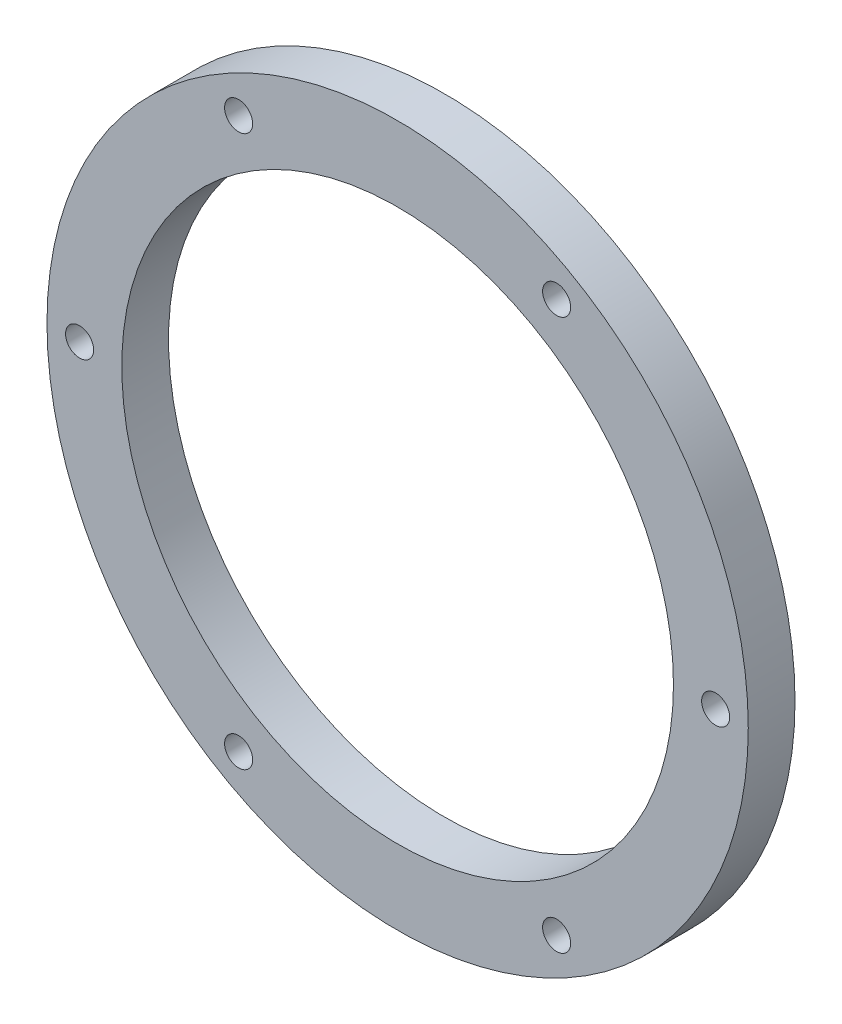
ISO-10303-21;
HEADER;
FILE_DESCRIPTION(('STEP AP214'),'2;1');
FILE_NAME('part.step','',(''),(''),'','','');
FILE_SCHEMA(('AUTOMOTIVE_DESIGN { 1 0 10303 214 1 1 1 1 }'));
ENDSEC;
DATA;
#1=APPLICATION_CONTEXT('core data for automotive mechanical design processes');
#2=APPLICATION_PROTOCOL_DEFINITION('international standard','automotive_design',2000,#1);
#3=PRODUCT_CONTEXT('',#1,'mechanical');
#4=PRODUCT('Part','Part','',(#3));
#5=PRODUCT_RELATED_PRODUCT_CATEGORY('part','',(#4));
#6=PRODUCT_DEFINITION_FORMATION('','',#4);
#7=PRODUCT_DEFINITION_CONTEXT('part definition',#1,'design');
#8=PRODUCT_DEFINITION('design','',#6,#7);
#9=PRODUCT_DEFINITION_SHAPE('','',#8);
#10=(LENGTH_UNIT() NAMED_UNIT(*) SI_UNIT(.MILLI.,.METRE.));
#11=(NAMED_UNIT(*) PLANE_ANGLE_UNIT() SI_UNIT($,.RADIAN.));
#12=(NAMED_UNIT(*) SI_UNIT($,.STERADIAN.) SOLID_ANGLE_UNIT());
#13=UNCERTAINTY_MEASURE_WITH_UNIT(LENGTH_MEASURE(1.E-05),#10,'distance_accuracy_value','');
#14=(GEOMETRIC_REPRESENTATION_CONTEXT(3) GLOBAL_UNCERTAINTY_ASSIGNED_CONTEXT((#13)) GLOBAL_UNIT_ASSIGNED_CONTEXT((#10,
#11,#12)) REPRESENTATION_CONTEXT('',''));
#15=CARTESIAN_POINT('',(0.,0.,0.));
#16=DIRECTION('',(0.,0.,1.));
#17=DIRECTION('',(1.,0.,0.));
#18=AXIS2_PLACEMENT_3D('',#15,#16,#17);
#19=CARTESIAN_POINT('',(0.,0.,5.));
#20=DIRECTION('',(0.,0.,1.));
#21=DIRECTION('',(1.,0.,0.));
#22=AXIS2_PLACEMENT_3D('',#19,#20,#21);
#23=PLANE('',#22);
#24=CARTESIAN_POINT('',(34.01,0.,5.));
#25=DIRECTION('',(0.,0.,1.));
#26=DIRECTION('',(1.,0.,0.));
#27=AXIS2_PLACEMENT_3D('',#24,#25,#26);
#28=CIRCLE('',#27,1.5);
#29=CARTESIAN_POINT('',(35.51,0.,5.));
#30=VERTEX_POINT('',#29);
#31=EDGE_CURVE('E47',#30,#30,#28,.T.);
#32=ORIENTED_EDGE('',*,*,#31,.F.);
#33=EDGE_LOOP('',(#32));
#34=FACE_BOUND('',#33,.T.);
#35=CARTESIAN_POINT('',(17.0050000000001,-29.4535239827087,5.));
#36=DIRECTION('',(0.,0.,1.));
#37=DIRECTION('',(1.,0.,0.));
#38=AXIS2_PLACEMENT_3D('',#35,#36,#37);
#39=CIRCLE('',#38,1.5);
#40=CARTESIAN_POINT('',(18.5050000000001,-29.4535239827087,5.));
#41=VERTEX_POINT('',#40);
#42=EDGE_CURVE('E52',#41,#41,#39,.T.);
#43=ORIENTED_EDGE('',*,*,#42,.F.);
#44=EDGE_LOOP('',(#43));
#45=FACE_BOUND('',#44,.T.);
#46=CARTESIAN_POINT('',(-17.0050000000002,-29.4535239827087,5.));
#47=DIRECTION('',(0.,0.,1.));
#48=DIRECTION('',(1.,0.,0.));
#49=AXIS2_PLACEMENT_3D('',#46,#47,#48);
#50=CIRCLE('',#49,1.49999999999998);
#51=CARTESIAN_POINT('',(-15.5050000000002,-29.4535239827087,5.));
#52=VERTEX_POINT('',#51);
#53=EDGE_CURVE('E55',#52,#52,#50,.T.);
#54=ORIENTED_EDGE('',*,*,#53,.F.);
#55=EDGE_LOOP('',(#54));
#56=FACE_BOUND('',#55,.T.);
#57=CARTESIAN_POINT('',(-34.01,0.,5.));
#58=DIRECTION('',(0.,0.,1.));
#59=DIRECTION('',(1.,0.,0.));
#60=AXIS2_PLACEMENT_3D('',#57,#58,#59);
#61=CIRCLE('',#60,1.5);
#62=CARTESIAN_POINT('',(-32.51,0.,5.));
#63=VERTEX_POINT('',#62);
#64=EDGE_CURVE('E58',#63,#63,#61,.T.);
#65=ORIENTED_EDGE('',*,*,#64,.F.);
#66=EDGE_LOOP('',(#65));
#67=FACE_BOUND('',#66,.T.);
#68=CARTESIAN_POINT('',(-17.0050000000001,29.4535239827087,5.));
#69=DIRECTION('',(0.,0.,1.));
#70=DIRECTION('',(1.,0.,0.));
#71=AXIS2_PLACEMENT_3D('',#68,#69,#70);
#72=CIRCLE('',#71,1.5);
#73=CARTESIAN_POINT('',(-15.5050000000001,29.4535239827087,5.));
#74=VERTEX_POINT('',#73);
#75=EDGE_CURVE('E61',#74,#74,#72,.T.);
#76=ORIENTED_EDGE('',*,*,#75,.F.);
#77=EDGE_LOOP('',(#76));
#78=FACE_BOUND('',#77,.T.);
#79=CARTESIAN_POINT('',(17.0050000000001,29.4535239827087,5.));
#80=DIRECTION('',(0.,0.,1.));
#81=DIRECTION('',(1.,0.,0.));
#82=AXIS2_PLACEMENT_3D('',#79,#80,#81);
#83=CIRCLE('',#82,1.5);
#84=CARTESIAN_POINT('',(18.5050000000001,29.4535239827087,5.));
#85=VERTEX_POINT('',#84);
#86=EDGE_CURVE('E64',#85,#85,#83,.T.);
#87=ORIENTED_EDGE('',*,*,#86,.F.);
#88=EDGE_LOOP('',(#87));
#89=FACE_BOUND('',#88,.T.);
#90=CARTESIAN_POINT('',(0.,0.,5.));
#91=DIRECTION('',(0.,0.,1.));
#92=DIRECTION('',(1.,0.,0.));
#93=AXIS2_PLACEMENT_3D('',#90,#91,#92);
#94=CIRCLE('',#93,37.5);
#95=CARTESIAN_POINT('',(37.5,0.,5.));
#96=VERTEX_POINT('',#95);
#97=EDGE_CURVE('E10',#96,#96,#94,.T.);
#98=ORIENTED_EDGE('',*,*,#97,.T.);
#99=EDGE_LOOP('',(#98));
#100=FACE_BOUND('',#99,.T.);
#101=CARTESIAN_POINT('',(0.,0.,5.));
#102=DIRECTION('',(0.,0.,1.));
#103=DIRECTION('',(1.,0.,0.));
#104=AXIS2_PLACEMENT_3D('',#101,#102,#103);
#105=CIRCLE('',#104,29.5);
#106=CARTESIAN_POINT('',(29.5,0.,5.));
#107=VERTEX_POINT('',#106);
#108=EDGE_CURVE('E42',#107,#107,#105,.T.);
#109=ORIENTED_EDGE('',*,*,#108,.F.);
#110=EDGE_LOOP('',(#109));
#111=FACE_BOUND('',#110,.T.);
#112=ADVANCED_FACE('F31',(#34,#45,#56,#67,#78,#89,#100,#111),#23,.T.);
#113=CARTESIAN_POINT('',(0.,0.,0.));
#114=DIRECTION('',(0.,0.,1.));
#115=DIRECTION('',(1.,0.,0.));
#116=AXIS2_PLACEMENT_3D('',#113,#114,#115);
#117=PLANE('',#116);
#118=CARTESIAN_POINT('',(34.01,0.,0.));
#119=DIRECTION('',(0.,0.,-1.));
#120=DIRECTION('',(-1.,0.,0.));
#121=AXIS2_PLACEMENT_3D('',#118,#119,#120);
#122=CIRCLE('',#121,1.5);
#123=CARTESIAN_POINT('',(32.51,0.,0.));
#124=VERTEX_POINT('',#123);
#125=EDGE_CURVE('E71',#124,#124,#122,.T.);
#126=ORIENTED_EDGE('',*,*,#125,.F.);
#127=EDGE_LOOP('',(#126));
#128=FACE_BOUND('',#127,.T.);
#129=CARTESIAN_POINT('',(17.0050000000001,-29.4535239827087,0.));
#130=DIRECTION('',(0.,0.,-1.));
#131=DIRECTION('',(-1.,0.,0.));
#132=AXIS2_PLACEMENT_3D('',#129,#130,#131);
#133=CIRCLE('',#132,1.5);
#134=CARTESIAN_POINT('',(15.5050000000001,-29.4535239827087,0.));
#135=VERTEX_POINT('',#134);
#136=EDGE_CURVE('E74',#135,#135,#133,.T.);
#137=ORIENTED_EDGE('',*,*,#136,.F.);
#138=EDGE_LOOP('',(#137));
#139=FACE_BOUND('',#138,.T.);
#140=CARTESIAN_POINT('',(-17.0050000000002,-29.4535239827087,0.));
#141=DIRECTION('',(0.,0.,-1.));
#142=DIRECTION('',(-1.,0.,0.));
#143=AXIS2_PLACEMENT_3D('',#140,#141,#142);
#144=CIRCLE('',#143,1.49999999999998);
#145=CARTESIAN_POINT('',(-18.5050000000001,-29.4535239827087,0.));
#146=VERTEX_POINT('',#145);
#147=EDGE_CURVE('E77',#146,#146,#144,.T.);
#148=ORIENTED_EDGE('',*,*,#147,.F.);
#149=EDGE_LOOP('',(#148));
#150=FACE_BOUND('',#149,.T.);
#151=CARTESIAN_POINT('',(-34.01,0.,0.));
#152=DIRECTION('',(0.,0.,-1.));
#153=DIRECTION('',(-1.,0.,0.));
#154=AXIS2_PLACEMENT_3D('',#151,#152,#153);
#155=CIRCLE('',#154,1.5);
#156=CARTESIAN_POINT('',(-35.51,0.,0.));
#157=VERTEX_POINT('',#156);
#158=EDGE_CURVE('E80',#157,#157,#155,.T.);
#159=ORIENTED_EDGE('',*,*,#158,.F.);
#160=EDGE_LOOP('',(#159));
#161=FACE_BOUND('',#160,.T.);
#162=CARTESIAN_POINT('',(-17.0050000000001,29.4535239827087,0.));
#163=DIRECTION('',(0.,0.,-1.));
#164=DIRECTION('',(-1.,0.,0.));
#165=AXIS2_PLACEMENT_3D('',#162,#163,#164);
#166=CIRCLE('',#165,1.5);
#167=CARTESIAN_POINT('',(-18.5050000000001,29.4535239827087,0.));
#168=VERTEX_POINT('',#167);
#169=EDGE_CURVE('E70',#168,#168,#166,.T.);
#170=ORIENTED_EDGE('',*,*,#169,.F.);
#171=EDGE_LOOP('',(#170));
#172=FACE_BOUND('',#171,.T.);
#173=CARTESIAN_POINT('',(17.0050000000001,29.4535239827087,0.));
#174=DIRECTION('',(0.,0.,-1.));
#175=DIRECTION('',(-1.,0.,0.));
#176=AXIS2_PLACEMENT_3D('',#173,#174,#175);
#177=CIRCLE('',#176,1.5);
#178=CARTESIAN_POINT('',(15.5050000000001,29.4535239827087,0.));
#179=VERTEX_POINT('',#178);
#180=EDGE_CURVE('E67',#179,#179,#177,.T.);
#181=ORIENTED_EDGE('',*,*,#180,.F.);
#182=EDGE_LOOP('',(#181));
#183=FACE_BOUND('',#182,.T.);
#184=CARTESIAN_POINT('',(0.,0.,0.));
#185=DIRECTION('',(0.,0.,1.));
#186=DIRECTION('',(1.,0.,0.));
#187=AXIS2_PLACEMENT_3D('',#184,#185,#186);
#188=CIRCLE('',#187,37.5);
#189=CARTESIAN_POINT('',(37.5,0.,0.));
#190=VERTEX_POINT('',#189);
#191=EDGE_CURVE('E35',#190,#190,#188,.T.);
#192=ORIENTED_EDGE('',*,*,#191,.F.);
#193=EDGE_LOOP('',(#192));
#194=FACE_BOUND('',#193,.T.);
#195=CARTESIAN_POINT('',(0.,0.,0.));
#196=DIRECTION('',(0.,0.,1.));
#197=DIRECTION('',(1.,0.,0.));
#198=AXIS2_PLACEMENT_3D('',#195,#196,#197);
#199=CIRCLE('',#198,29.5);
#200=CARTESIAN_POINT('',(29.5,0.,0.));
#201=VERTEX_POINT('',#200);
#202=EDGE_CURVE('E44',#201,#201,#199,.T.);
#203=ORIENTED_EDGE('',*,*,#202,.T.);
#204=EDGE_LOOP('',(#203));
#205=FACE_BOUND('',#204,.T.);
#206=ADVANCED_FACE('F88',(#128,#139,#150,#161,#172,#183,#194,#205),#117,.F.);
#207=CARTESIAN_POINT('',(0.,0.,5.));
#208=DIRECTION('',(0.,0.,-1.));
#209=DIRECTION('',(-1.,0.,0.));
#210=AXIS2_PLACEMENT_3D('',#207,#208,#209);
#211=CYLINDRICAL_SURFACE('',#210,37.5);
#212=ORIENTED_EDGE('',*,*,#97,.F.);
#213=EDGE_LOOP('',(#212));
#214=FACE_BOUND('',#213,.T.);
#215=ORIENTED_EDGE('',*,*,#191,.T.);
#216=EDGE_LOOP('',(#215));
#217=FACE_BOUND('',#216,.T.);
#218=ADVANCED_FACE('F33',(#214,#217),#211,.T.);
#219=CARTESIAN_POINT('',(0.,0.,5.));
#220=DIRECTION('',(0.,0.,-1.));
#221=DIRECTION('',(-1.,0.,0.));
#222=AXIS2_PLACEMENT_3D('',#219,#220,#221);
#223=CYLINDRICAL_SURFACE('',#222,29.5);
#224=ORIENTED_EDGE('',*,*,#108,.T.);
#225=EDGE_LOOP('',(#224));
#226=FACE_BOUND('',#225,.T.);
#227=ORIENTED_EDGE('',*,*,#202,.F.);
#228=EDGE_LOOP('',(#227));
#229=FACE_BOUND('',#228,.T.);
#230=ADVANCED_FACE('F98',(#226,#229),#223,.F.);
#231=CARTESIAN_POINT('',(17.0050000000001,29.4535239827087,11.));
#232=DIRECTION('',(0.,0.,-1.));
#233=DIRECTION('',(-1.,0.,0.));
#234=AXIS2_PLACEMENT_3D('',#231,#232,#233);
#235=CYLINDRICAL_SURFACE('',#234,1.5);
#236=ORIENTED_EDGE('',*,*,#86,.T.);
#237=EDGE_LOOP('',(#236));
#238=FACE_BOUND('',#237,.T.);
#239=ORIENTED_EDGE('',*,*,#180,.T.);
#240=EDGE_LOOP('',(#239));
#241=FACE_BOUND('',#240,.T.);
#242=ADVANCED_FACE('F100',(#238,#241),#235,.F.);
#243=CARTESIAN_POINT('',(-17.0050000000001,29.4535239827087,11.));
#244=DIRECTION('',(0.,0.,-1.));
#245=DIRECTION('',(-1.,0.,0.));
#246=AXIS2_PLACEMENT_3D('',#243,#244,#245);
#247=CYLINDRICAL_SURFACE('',#246,1.5);
#248=ORIENTED_EDGE('',*,*,#75,.T.);
#249=EDGE_LOOP('',(#248));
#250=FACE_BOUND('',#249,.T.);
#251=ORIENTED_EDGE('',*,*,#169,.T.);
#252=EDGE_LOOP('',(#251));
#253=FACE_BOUND('',#252,.T.);
#254=ADVANCED_FACE('F86',(#250,#253),#247,.F.);
#255=CARTESIAN_POINT('',(-34.01,0.,11.));
#256=DIRECTION('',(0.,0.,-1.));
#257=DIRECTION('',(-1.,0.,0.));
#258=AXIS2_PLACEMENT_3D('',#255,#256,#257);
#259=CYLINDRICAL_SURFACE('',#258,1.5);
#260=ORIENTED_EDGE('',*,*,#64,.T.);
#261=EDGE_LOOP('',(#260));
#262=FACE_BOUND('',#261,.T.);
#263=ORIENTED_EDGE('',*,*,#158,.T.);
#264=EDGE_LOOP('',(#263));
#265=FACE_BOUND('',#264,.T.);
#266=ADVANCED_FACE('F131',(#262,#265),#259,.F.);
#267=CARTESIAN_POINT('',(-17.0050000000002,-29.4535239827087,11.));
#268=DIRECTION('',(0.,0.,-1.));
#269=DIRECTION('',(-1.,0.,0.));
#270=AXIS2_PLACEMENT_3D('',#267,#268,#269);
#271=CYLINDRICAL_SURFACE('',#270,1.49999999999998);
#272=ORIENTED_EDGE('',*,*,#53,.T.);
#273=EDGE_LOOP('',(#272));
#274=FACE_BOUND('',#273,.T.);
#275=ORIENTED_EDGE('',*,*,#147,.T.);
#276=EDGE_LOOP('',(#275));
#277=FACE_BOUND('',#276,.T.);
#278=ADVANCED_FACE('F136',(#274,#277),#271,.F.);
#279=CARTESIAN_POINT('',(17.0050000000001,-29.4535239827087,11.));
#280=DIRECTION('',(0.,0.,-1.));
#281=DIRECTION('',(-1.,0.,0.));
#282=AXIS2_PLACEMENT_3D('',#279,#280,#281);
#283=CYLINDRICAL_SURFACE('',#282,1.5);
#284=ORIENTED_EDGE('',*,*,#42,.T.);
#285=EDGE_LOOP('',(#284));
#286=FACE_BOUND('',#285,.T.);
#287=ORIENTED_EDGE('',*,*,#136,.T.);
#288=EDGE_LOOP('',(#287));
#289=FACE_BOUND('',#288,.T.);
#290=ADVANCED_FACE('F142',(#286,#289),#283,.F.);
#291=CARTESIAN_POINT('',(34.01,0.,11.));
#292=DIRECTION('',(0.,0.,-1.));
#293=DIRECTION('',(-1.,0.,0.));
#294=AXIS2_PLACEMENT_3D('',#291,#292,#293);
#295=CYLINDRICAL_SURFACE('',#294,1.5);
#296=ORIENTED_EDGE('',*,*,#31,.T.);
#297=EDGE_LOOP('',(#296));
#298=FACE_BOUND('',#297,.T.);
#299=ORIENTED_EDGE('',*,*,#125,.T.);
#300=EDGE_LOOP('',(#299));
#301=FACE_BOUND('',#300,.T.);
#302=ADVANCED_FACE('F146',(#298,#301),#295,.F.);
#303=CLOSED_SHELL('',(#112,#206,#218,#230,#242,#254,#266,#278,#290,#302));
#304=MANIFOLD_SOLID_BREP('B2',#303);
#305=ADVANCED_BREP_SHAPE_REPRESENTATION('',(#18,#304),#14);
#306=SHAPE_DEFINITION_REPRESENTATION(#9,#305);
ENDSEC;
END-ISO-10303-21;
